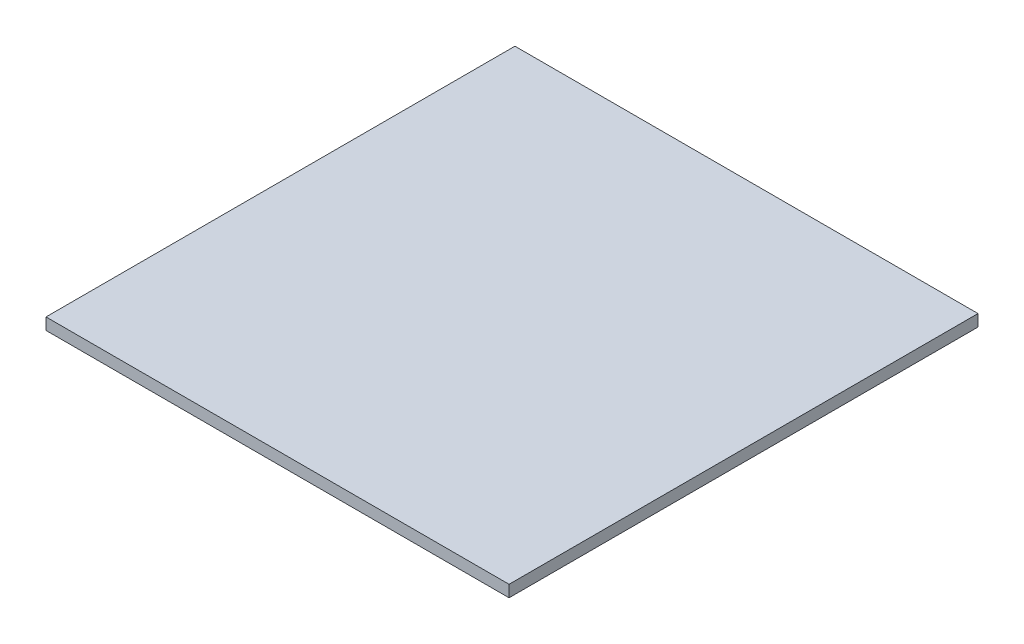
ISO-10303-21;
HEADER;
FILE_DESCRIPTION(('STEP AP214'),'2;1');
FILE_NAME('part.step','',(''),(''),'','','');
FILE_SCHEMA(('AUTOMOTIVE_DESIGN { 1 0 10303 214 1 1 1 1 }'));
ENDSEC;
DATA;
#1=APPLICATION_CONTEXT('core data for automotive mechanical design processes');
#2=APPLICATION_PROTOCOL_DEFINITION('international standard','automotive_design',2000,#1);
#3=PRODUCT_CONTEXT('',#1,'mechanical');
#4=PRODUCT('Part','Part','',(#3));
#5=PRODUCT_RELATED_PRODUCT_CATEGORY('part','',(#4));
#6=PRODUCT_DEFINITION_FORMATION('','',#4);
#7=PRODUCT_DEFINITION_CONTEXT('part definition',#1,'design');
#8=PRODUCT_DEFINITION('design','',#6,#7);
#9=PRODUCT_DEFINITION_SHAPE('','',#8);
#10=(LENGTH_UNIT() NAMED_UNIT(*) SI_UNIT(.MILLI.,.METRE.));
#11=(NAMED_UNIT(*) PLANE_ANGLE_UNIT() SI_UNIT($,.RADIAN.));
#12=(NAMED_UNIT(*) SI_UNIT($,.STERADIAN.) SOLID_ANGLE_UNIT());
#13=UNCERTAINTY_MEASURE_WITH_UNIT(LENGTH_MEASURE(1.E-05),#10,'distance_accuracy_value','');
#14=(GEOMETRIC_REPRESENTATION_CONTEXT(3) GLOBAL_UNCERTAINTY_ASSIGNED_CONTEXT((#13)) GLOBAL_UNIT_ASSIGNED_CONTEXT((#10,
#11,#12)) REPRESENTATION_CONTEXT('',''));
#15=CARTESIAN_POINT('',(0.,0.,0.));
#16=DIRECTION('',(0.,0.,1.));
#17=DIRECTION('',(1.,0.,0.));
#18=AXIS2_PLACEMENT_3D('',#15,#16,#17);
#19=CARTESIAN_POINT('',(79.,4.,-80.));
#20=DIRECTION('',(-1.,0.,0.));
#21=DIRECTION('',(0.,0.,1.));
#22=AXIS2_PLACEMENT_3D('',#19,#20,#21);
#23=PLANE('',#22);
#24=DIRECTION('',(0.,0.,-1.));
#25=VECTOR('',#24,1.);
#26=CARTESIAN_POINT('',(79.,0.,-80.));
#27=LINE('',#26,#25);
#28=CARTESIAN_POINT('',(79.,0.,80.));
#29=VERTEX_POINT('',#28);
#30=CARTESIAN_POINT('',(79.,0.,-80.));
#31=VERTEX_POINT('',#30);
#32=EDGE_CURVE('E98',#29,#31,#27,.T.);
#33=ORIENTED_EDGE('',*,*,#32,.T.);
#34=DIRECTION('',(0.,-1.,0.));
#35=VECTOR('',#34,1.);
#36=CARTESIAN_POINT('',(79.,4.,-80.));
#37=LINE('',#36,#35);
#38=CARTESIAN_POINT('',(79.,4.,-80.));
#39=VERTEX_POINT('',#38);
#40=EDGE_CURVE('E11',#39,#31,#37,.T.);
#41=ORIENTED_EDGE('',*,*,#40,.F.);
#42=DIRECTION('',(0.,0.,-1.));
#43=VECTOR('',#42,1.);
#44=CARTESIAN_POINT('',(79.,4.,-80.));
#45=LINE('',#44,#43);
#46=CARTESIAN_POINT('',(79.,4.,80.));
#47=VERTEX_POINT('',#46);
#48=EDGE_CURVE('E86',#47,#39,#45,.T.);
#49=ORIENTED_EDGE('',*,*,#48,.F.);
#50=DIRECTION('',(0.,-1.,0.));
#51=VECTOR('',#50,1.);
#52=CARTESIAN_POINT('',(79.,4.,80.));
#53=LINE('',#52,#51);
#54=EDGE_CURVE('E94',#47,#29,#53,.T.);
#55=ORIENTED_EDGE('',*,*,#54,.T.);
#56=EDGE_LOOP('',(#33,#41,#49,#55));
#57=FACE_BOUND('',#56,.T.);
#58=ADVANCED_FACE('F35',(#57),#23,.F.);
#59=CARTESIAN_POINT('',(-79.,4.,-80.));
#60=DIRECTION('',(0.,0.,1.));
#61=DIRECTION('',(1.,0.,0.));
#62=AXIS2_PLACEMENT_3D('',#59,#60,#61);
#63=PLANE('',#62);
#64=DIRECTION('',(-1.,0.,0.));
#65=VECTOR('',#64,1.);
#66=CARTESIAN_POINT('',(-79.,0.,-80.));
#67=LINE('',#66,#65);
#68=CARTESIAN_POINT('',(-79.,0.,-80.));
#69=VERTEX_POINT('',#68);
#70=EDGE_CURVE('E90',#31,#69,#67,.T.);
#71=ORIENTED_EDGE('',*,*,#70,.T.);
#72=DIRECTION('',(0.,-1.,0.));
#73=VECTOR('',#72,1.);
#74=CARTESIAN_POINT('',(-79.,4.,-80.));
#75=LINE('',#74,#73);
#76=CARTESIAN_POINT('',(-79.,4.,-80.));
#77=VERTEX_POINT('',#76);
#78=EDGE_CURVE('E43',#77,#69,#75,.T.);
#79=ORIENTED_EDGE('',*,*,#78,.F.);
#80=DIRECTION('',(-1.,0.,0.));
#81=VECTOR('',#80,1.);
#82=CARTESIAN_POINT('',(-79.,4.,-80.));
#83=LINE('',#82,#81);
#84=EDGE_CURVE('E81',#39,#77,#83,.T.);
#85=ORIENTED_EDGE('',*,*,#84,.F.);
#86=ORIENTED_EDGE('',*,*,#40,.T.);
#87=EDGE_LOOP('',(#71,#79,#85,#86));
#88=FACE_BOUND('',#87,.T.);
#89=ADVANCED_FACE('F89',(#88),#63,.F.);
#90=CARTESIAN_POINT('',(-79.,4.,-80.));
#91=DIRECTION('',(1.,0.,0.));
#92=DIRECTION('',(0.,0.,-1.));
#93=AXIS2_PLACEMENT_3D('',#90,#91,#92);
#94=PLANE('',#93);
#95=DIRECTION('',(0.,0.,1.));
#96=VECTOR('',#95,1.);
#97=CARTESIAN_POINT('',(-79.,0.,-80.));
#98=LINE('',#97,#96);
#99=CARTESIAN_POINT('',(-79.,0.,80.));
#100=VERTEX_POINT('',#99);
#101=EDGE_CURVE('E68',#69,#100,#98,.T.);
#102=ORIENTED_EDGE('',*,*,#101,.T.);
#103=DIRECTION('',(0.,-1.,0.));
#104=VECTOR('',#103,1.);
#105=CARTESIAN_POINT('',(-79.,4.,80.));
#106=LINE('',#105,#104);
#107=CARTESIAN_POINT('',(-79.,4.,80.));
#108=VERTEX_POINT('',#107);
#109=EDGE_CURVE('E91',#108,#100,#106,.T.);
#110=ORIENTED_EDGE('',*,*,#109,.F.);
#111=DIRECTION('',(0.,0.,1.));
#112=VECTOR('',#111,1.);
#113=CARTESIAN_POINT('',(-79.,4.,-80.));
#114=LINE('',#113,#112);
#115=EDGE_CURVE('E84',#77,#108,#114,.T.);
#116=ORIENTED_EDGE('',*,*,#115,.F.);
#117=ORIENTED_EDGE('',*,*,#78,.T.);
#118=EDGE_LOOP('',(#102,#110,#116,#117));
#119=FACE_BOUND('',#118,.T.);
#120=ADVANCED_FACE('F92',(#119),#94,.F.);
#121=CARTESIAN_POINT('',(-79.,4.,80.));
#122=DIRECTION('',(0.,0.,-1.));
#123=DIRECTION('',(-1.,0.,0.));
#124=AXIS2_PLACEMENT_3D('',#121,#122,#123);
#125=PLANE('',#124);
#126=DIRECTION('',(1.,0.,0.));
#127=VECTOR('',#126,1.);
#128=CARTESIAN_POINT('',(-79.,0.,80.));
#129=LINE('',#128,#127);
#130=EDGE_CURVE('E74',#100,#29,#129,.T.);
#131=ORIENTED_EDGE('',*,*,#130,.T.);
#132=ORIENTED_EDGE('',*,*,#54,.F.);
#133=DIRECTION('',(1.,0.,0.));
#134=VECTOR('',#133,1.);
#135=CARTESIAN_POINT('',(-79.,4.,80.));
#136=LINE('',#135,#134);
#137=EDGE_CURVE('E51',#108,#47,#136,.T.);
#138=ORIENTED_EDGE('',*,*,#137,.F.);
#139=ORIENTED_EDGE('',*,*,#109,.T.);
#140=EDGE_LOOP('',(#131,#132,#138,#139));
#141=FACE_BOUND('',#140,.T.);
#142=ADVANCED_FACE('F105',(#141),#125,.F.);
#143=CARTESIAN_POINT('',(0.,4.,0.));
#144=DIRECTION('',(0.,1.,0.));
#145=DIRECTION('',(0.,0.,1.));
#146=AXIS2_PLACEMENT_3D('',#143,#144,#145);
#147=PLANE('',#146);
#148=ORIENTED_EDGE('',*,*,#48,.T.);
#149=ORIENTED_EDGE('',*,*,#84,.T.);
#150=ORIENTED_EDGE('',*,*,#115,.T.);
#151=ORIENTED_EDGE('',*,*,#137,.T.);
#152=EDGE_LOOP('',(#148,#149,#150,#151));
#153=FACE_BOUND('',#152,.T.);
#154=ADVANCED_FACE('F82',(#153),#147,.T.);
#155=CARTESIAN_POINT('',(0.,0.,0.));
#156=DIRECTION('',(0.,1.,0.));
#157=DIRECTION('',(0.,0.,1.));
#158=AXIS2_PLACEMENT_3D('',#155,#156,#157);
#159=PLANE('',#158);
#160=ORIENTED_EDGE('',*,*,#32,.F.);
#161=ORIENTED_EDGE('',*,*,#130,.F.);
#162=ORIENTED_EDGE('',*,*,#101,.F.);
#163=ORIENTED_EDGE('',*,*,#70,.F.);
#164=EDGE_LOOP('',(#160,#161,#162,#163));
#165=FACE_BOUND('',#164,.T.);
#166=ADVANCED_FACE('F108',(#165),#159,.F.);
#167=CLOSED_SHELL('',(#58,#89,#120,#142,#154,#166));
#168=MANIFOLD_SOLID_BREP('B2',#167);
#169=ADVANCED_BREP_SHAPE_REPRESENTATION('',(#18,#168),#14);
#170=SHAPE_DEFINITION_REPRESENTATION(#9,#169);
ENDSEC;
END-ISO-10303-21;
